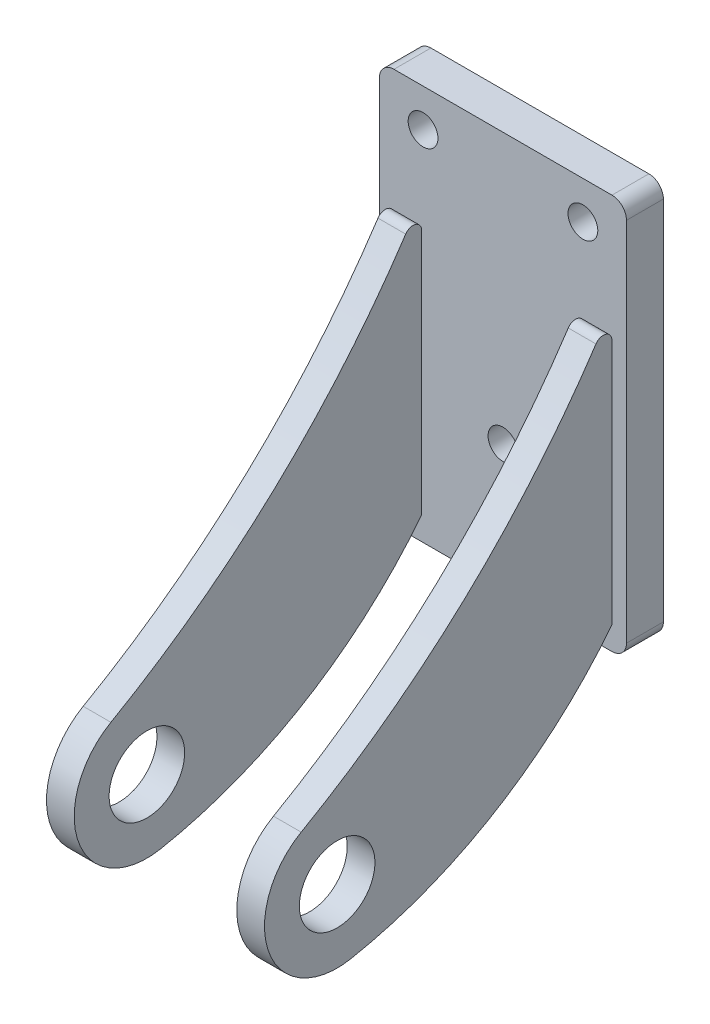
ISO-10303-21;
HEADER;
FILE_DESCRIPTION(('STEP AP214'),'2;1');
FILE_NAME('part.step','',(''),(''),'','','');
FILE_SCHEMA(('AUTOMOTIVE_DESIGN { 1 0 10303 214 1 1 1 1 }'));
ENDSEC;
DATA;
#1=APPLICATION_CONTEXT('core data for automotive mechanical design processes');
#2=APPLICATION_PROTOCOL_DEFINITION('international standard','automotive_design',2000,#1);
#3=PRODUCT_CONTEXT('',#1,'mechanical');
#4=PRODUCT('Part','Part','',(#3));
#5=PRODUCT_RELATED_PRODUCT_CATEGORY('part','',(#4));
#6=PRODUCT_DEFINITION_FORMATION('','',#4);
#7=PRODUCT_DEFINITION_CONTEXT('part definition',#1,'design');
#8=PRODUCT_DEFINITION('design','',#6,#7);
#9=PRODUCT_DEFINITION_SHAPE('','',#8);
#10=(LENGTH_UNIT() NAMED_UNIT(*) SI_UNIT(.MILLI.,.METRE.));
#11=(NAMED_UNIT(*) PLANE_ANGLE_UNIT() SI_UNIT($,.RADIAN.));
#12=(NAMED_UNIT(*) SI_UNIT($,.STERADIAN.) SOLID_ANGLE_UNIT());
#13=UNCERTAINTY_MEASURE_WITH_UNIT(LENGTH_MEASURE(1.E-05),#10,'distance_accuracy_value','');
#14=(GEOMETRIC_REPRESENTATION_CONTEXT(3) GLOBAL_UNCERTAINTY_ASSIGNED_CONTEXT((#13)) GLOBAL_UNIT_ASSIGNED_CONTEXT((#10,
#11,#12)) REPRESENTATION_CONTEXT('',''));
#15=CARTESIAN_POINT('',(0.,0.,0.));
#16=DIRECTION('',(0.,0.,1.));
#17=DIRECTION('',(1.,0.,0.));
#18=AXIS2_PLACEMENT_3D('',#15,#16,#17);
#19=CARTESIAN_POINT('',(37.5,-63.,6.35));
#20=DIRECTION('',(0.,0.,1.));
#21=DIRECTION('',(1.,0.,0.));
#22=AXIS2_PLACEMENT_3D('',#19,#20,#21);
#23=PLANE('',#22);
#24=CARTESIAN_POINT('',(0.,-25.,6.35));
#25=DIRECTION('',(0.,0.,1.));
#26=DIRECTION('',(1.,0.,0.));
#27=AXIS2_PLACEMENT_3D('',#24,#25,#26);
#28=CIRCLE('',#27,5.125);
#29=CARTESIAN_POINT('',(5.125,-25.,6.35));
#30=VERTEX_POINT('',#29);
#31=EDGE_CURVE('P0_E205',#30,#30,#28,.T.);
#32=ORIENTED_EDGE('',*,*,#31,.F.);
#33=EDGE_LOOP('',(#32));
#34=FACE_BOUND('',#33,.T.);
#35=CARTESIAN_POINT('',(-27.5,55.,6.35));
#36=DIRECTION('',(0.,0.,1.));
#37=DIRECTION('',(1.,0.,0.));
#38=AXIS2_PLACEMENT_3D('',#35,#36,#37);
#39=CIRCLE('',#38,5.125);
#40=CARTESIAN_POINT('',(-22.375,55.,6.35));
#41=VERTEX_POINT('',#40);
#42=EDGE_CURVE('P0_E188',#41,#41,#39,.T.);
#43=ORIENTED_EDGE('',*,*,#42,.F.);
#44=EDGE_LOOP('',(#43));
#45=FACE_BOUND('',#44,.T.);
#46=CARTESIAN_POINT('',(37.5,-63.,6.35));
#47=DIRECTION('',(0.,0.,1.));
#48=DIRECTION('',(1.,0.,0.));
#49=AXIS2_PLACEMENT_3D('',#46,#47,#48);
#50=CIRCLE('',#49,5.);
#51=CARTESIAN_POINT('',(37.5,-68.,6.35));
#52=VERTEX_POINT('',#51);
#53=CARTESIAN_POINT('',(42.5,-63.,6.35));
#54=VERTEX_POINT('',#53);
#55=EDGE_CURVE('P0_E151',#52,#54,#50,.T.);
#56=ORIENTED_EDGE('',*,*,#55,.T.);
#57=DIRECTION('',(0.,1.,0.));
#58=VECTOR('',#57,1.);
#59=CARTESIAN_POINT('',(42.5,63.,6.35));
#60=LINE('',#59,#58);
#61=CARTESIAN_POINT('',(42.5,63.,6.35));
#62=VERTEX_POINT('',#61);
#63=EDGE_CURVE('P0_E99',#54,#62,#60,.T.);
#64=ORIENTED_EDGE('',*,*,#63,.T.);
#65=CARTESIAN_POINT('',(37.5,63.,6.35));
#66=DIRECTION('',(0.,0.,1.));
#67=DIRECTION('',(-1.,0.,0.));
#68=AXIS2_PLACEMENT_3D('',#65,#66,#67);
#69=CIRCLE('',#68,5.);
#70=CARTESIAN_POINT('',(37.5,68.,6.35));
#71=VERTEX_POINT('',#70);
#72=EDGE_CURVE('P0_E166',#62,#71,#69,.T.);
#73=ORIENTED_EDGE('',*,*,#72,.T.);
#74=DIRECTION('',(-1.,0.,0.));
#75=VECTOR('',#74,1.);
#76=CARTESIAN_POINT('',(-37.5,68.,6.35));
#77=LINE('',#76,#75);
#78=CARTESIAN_POINT('',(-37.5,68.,6.35));
#79=VERTEX_POINT('',#78);
#80=EDGE_CURVE('P0_E179',#71,#79,#77,.T.);
#81=ORIENTED_EDGE('',*,*,#80,.T.);
#82=CARTESIAN_POINT('',(-37.5,63.,6.35));
#83=DIRECTION('',(0.,0.,1.));
#84=DIRECTION('',(1.,0.,0.));
#85=AXIS2_PLACEMENT_3D('',#82,#83,#84);
#86=CIRCLE('',#85,5.);
#87=CARTESIAN_POINT('',(-42.5,63.,6.35));
#88=VERTEX_POINT('',#87);
#89=EDGE_CURVE('P0_E118',#79,#88,#86,.T.);
#90=ORIENTED_EDGE('',*,*,#89,.T.);
#91=DIRECTION('',(0.,-1.,0.));
#92=VECTOR('',#91,1.);
#93=CARTESIAN_POINT('',(-42.5,63.,6.35));
#94=LINE('',#93,#92);
#95=CARTESIAN_POINT('',(-42.5,-63.,6.35));
#96=VERTEX_POINT('',#95);
#97=EDGE_CURVE('P0_E112',#88,#96,#94,.T.);
#98=ORIENTED_EDGE('',*,*,#97,.T.);
#99=CARTESIAN_POINT('',(-37.5,-63.,6.35));
#100=DIRECTION('',(0.,0.,1.));
#101=DIRECTION('',(1.,0.,0.));
#102=AXIS2_PLACEMENT_3D('',#99,#100,#101);
#103=CIRCLE('',#102,5.);
#104=CARTESIAN_POINT('',(-37.5,-68.,6.35));
#105=VERTEX_POINT('',#104);
#106=EDGE_CURVE('P0_E116',#96,#105,#103,.T.);
#107=ORIENTED_EDGE('',*,*,#106,.T.);
#108=DIRECTION('',(1.,0.,0.));
#109=VECTOR('',#108,1.);
#110=CARTESIAN_POINT('',(-37.5,-68.,6.35));
#111=LINE('',#110,#109);
#112=EDGE_CURVE('P0_E56',#105,#52,#111,.T.);
#113=ORIENTED_EDGE('',*,*,#112,.T.);
#114=EDGE_LOOP('',(#56,#64,#73,#81,#90,#98,#107,#113));
#115=FACE_BOUND('',#114,.T.);
#116=CARTESIAN_POINT('',(0.,-55.,6.35));
#117=DIRECTION('',(0.,0.,1.));
#118=DIRECTION('',(1.,0.,0.));
#119=AXIS2_PLACEMENT_3D('',#116,#117,#118);
#120=CIRCLE('',#119,5.125);
#121=CARTESIAN_POINT('',(5.12500000000001,-55.,6.35));
#122=VERTEX_POINT('',#121);
#123=EDGE_CURVE('P0_E140',#122,#122,#120,.T.);
#124=ORIENTED_EDGE('',*,*,#123,.F.);
#125=EDGE_LOOP('',(#124));
#126=FACE_BOUND('',#125,.T.);
#127=CARTESIAN_POINT('',(27.5,55.,6.35));
#128=DIRECTION('',(0.,0.,1.));
#129=DIRECTION('',(-1.,0.,0.));
#130=AXIS2_PLACEMENT_3D('',#127,#128,#129);
#131=CIRCLE('',#130,5.125);
#132=CARTESIAN_POINT('',(22.375,55.,6.35));
#133=VERTEX_POINT('',#132);
#134=EDGE_CURVE('P0_E194',#133,#133,#131,.T.);
#135=ORIENTED_EDGE('',*,*,#134,.F.);
#136=EDGE_LOOP('',(#135));
#137=FACE_BOUND('',#136,.T.);
#138=ADVANCED_FACE('P0_F39',(#34,#45,#115,#126,#137),#23,.T.);
#139=CARTESIAN_POINT('',(37.5,-63.,-6.35));
#140=DIRECTION('',(0.,0.,1.));
#141=DIRECTION('',(1.,0.,0.));
#142=AXIS2_PLACEMENT_3D('',#139,#140,#141);
#143=PLANE('',#142);
#144=CARTESIAN_POINT('',(0.,-25.,-6.35));
#145=DIRECTION('',(0.,0.,1.));
#146=DIRECTION('',(1.,0.,0.));
#147=AXIS2_PLACEMENT_3D('',#144,#145,#146);
#148=CIRCLE('',#147,5.125);
#149=CARTESIAN_POINT('',(5.125,-25.,-6.35));
#150=VERTEX_POINT('',#149);
#151=EDGE_CURVE('P0_E200',#150,#150,#148,.F.);
#152=ORIENTED_EDGE('',*,*,#151,.F.);
#153=EDGE_LOOP('',(#152));
#154=FACE_BOUND('',#153,.T.);
#155=CARTESIAN_POINT('',(37.5,-63.,-6.35));
#156=DIRECTION('',(0.,0.,1.));
#157=DIRECTION('',(1.,0.,0.));
#158=AXIS2_PLACEMENT_3D('',#155,#156,#157);
#159=CIRCLE('',#158,5.);
#160=CARTESIAN_POINT('',(37.5,-68.,-6.35));
#161=VERTEX_POINT('',#160);
#162=CARTESIAN_POINT('',(42.5,-63.,-6.35));
#163=VERTEX_POINT('',#162);
#164=EDGE_CURVE('P0_E136',#161,#163,#159,.T.);
#165=ORIENTED_EDGE('',*,*,#164,.F.);
#166=DIRECTION('',(1.,0.,0.));
#167=VECTOR('',#166,1.);
#168=CARTESIAN_POINT('',(-37.5,-68.,-6.35));
#169=LINE('',#168,#167);
#170=CARTESIAN_POINT('',(-37.5,-68.,-6.35));
#171=VERTEX_POINT('',#170);
#172=EDGE_CURVE('P0_E91',#171,#161,#169,.T.);
#173=ORIENTED_EDGE('',*,*,#172,.F.);
#174=CARTESIAN_POINT('',(-37.5,-63.,-6.35));
#175=DIRECTION('',(0.,0.,1.));
#176=DIRECTION('',(1.,0.,0.));
#177=AXIS2_PLACEMENT_3D('',#174,#175,#176);
#178=CIRCLE('',#177,5.);
#179=CARTESIAN_POINT('',(-42.5,-63.,-6.35));
#180=VERTEX_POINT('',#179);
#181=EDGE_CURVE('P0_E85',#180,#171,#178,.T.);
#182=ORIENTED_EDGE('',*,*,#181,.F.);
#183=DIRECTION('',(0.,-1.,0.));
#184=VECTOR('',#183,1.);
#185=CARTESIAN_POINT('',(-42.5,63.,-6.35));
#186=LINE('',#185,#184);
#187=CARTESIAN_POINT('',(-42.5,63.,-6.35));
#188=VERTEX_POINT('',#187);
#189=EDGE_CURVE('P0_E125',#188,#180,#186,.T.);
#190=ORIENTED_EDGE('',*,*,#189,.F.);
#191=CARTESIAN_POINT('',(-37.5,63.,-6.35));
#192=DIRECTION('',(0.,0.,1.));
#193=DIRECTION('',(1.,0.,0.));
#194=AXIS2_PLACEMENT_3D('',#191,#192,#193);
#195=CIRCLE('',#194,5.);
#196=CARTESIAN_POINT('',(-37.5,68.,-6.35));
#197=VERTEX_POINT('',#196);
#198=EDGE_CURVE('P0_E146',#197,#188,#195,.T.);
#199=ORIENTED_EDGE('',*,*,#198,.F.);
#200=DIRECTION('',(-1.,0.,0.));
#201=VECTOR('',#200,1.);
#202=CARTESIAN_POINT('',(-37.5,68.,-6.35));
#203=LINE('',#202,#201);
#204=CARTESIAN_POINT('',(37.5,68.,-6.35));
#205=VERTEX_POINT('',#204);
#206=EDGE_CURVE('P0_E144',#205,#197,#203,.T.);
#207=ORIENTED_EDGE('',*,*,#206,.F.);
#208=CARTESIAN_POINT('',(37.5,63.,-6.35));
#209=DIRECTION('',(0.,0.,1.));
#210=DIRECTION('',(-1.,0.,0.));
#211=AXIS2_PLACEMENT_3D('',#208,#209,#210);
#212=CIRCLE('',#211,5.);
#213=CARTESIAN_POINT('',(42.5,63.,-6.35));
#214=VERTEX_POINT('',#213);
#215=EDGE_CURVE('P0_E142',#214,#205,#212,.T.);
#216=ORIENTED_EDGE('',*,*,#215,.F.);
#217=DIRECTION('',(0.,1.,0.));
#218=VECTOR('',#217,1.);
#219=CARTESIAN_POINT('',(42.5,63.,-6.35));
#220=LINE('',#219,#218);
#221=EDGE_CURVE('P0_E139',#163,#214,#220,.T.);
#222=ORIENTED_EDGE('',*,*,#221,.F.);
#223=EDGE_LOOP('',(#165,#173,#182,#190,#199,#207,#216,#222));
#224=FACE_BOUND('',#223,.T.);
#225=CARTESIAN_POINT('',(0.,-55.,-6.35));
#226=DIRECTION('',(0.,0.,1.));
#227=DIRECTION('',(1.,0.,0.));
#228=AXIS2_PLACEMENT_3D('',#225,#226,#227);
#229=CIRCLE('',#228,5.125);
#230=CARTESIAN_POINT('',(5.12500000000001,-55.,-6.35));
#231=VERTEX_POINT('',#230);
#232=EDGE_CURVE('P0_E185',#231,#231,#229,.T.);
#233=ORIENTED_EDGE('',*,*,#232,.T.);
#234=EDGE_LOOP('',(#233));
#235=FACE_BOUND('',#234,.T.);
#236=CARTESIAN_POINT('',(-27.5,55.,-6.35));
#237=DIRECTION('',(0.,0.,1.));
#238=DIRECTION('',(1.,0.,0.));
#239=AXIS2_PLACEMENT_3D('',#236,#237,#238);
#240=CIRCLE('',#239,5.125);
#241=CARTESIAN_POINT('',(-22.375,55.,-6.35));
#242=VERTEX_POINT('',#241);
#243=EDGE_CURVE('P0_E191',#242,#242,#240,.T.);
#244=ORIENTED_EDGE('',*,*,#243,.T.);
#245=EDGE_LOOP('',(#244));
#246=FACE_BOUND('',#245,.T.);
#247=CARTESIAN_POINT('',(27.5,55.,-6.35));
#248=DIRECTION('',(0.,0.,1.));
#249=DIRECTION('',(-1.,0.,0.));
#250=AXIS2_PLACEMENT_3D('',#247,#248,#249);
#251=CIRCLE('',#250,5.125);
#252=CARTESIAN_POINT('',(22.375,55.,-6.35));
#253=VERTEX_POINT('',#252);
#254=EDGE_CURVE('P0_E197',#253,#253,#251,.T.);
#255=ORIENTED_EDGE('',*,*,#254,.T.);
#256=EDGE_LOOP('',(#255));
#257=FACE_BOUND('',#256,.T.);
#258=ADVANCED_FACE('P0_F170',(#154,#224,#235,#246,#257),#143,.F.);
#259=CARTESIAN_POINT('',(37.5,-63.,6.35));
#260=DIRECTION('',(0.,0.,-1.));
#261=DIRECTION('',(-1.,0.,0.));
#262=AXIS2_PLACEMENT_3D('',#259,#260,#261);
#263=CYLINDRICAL_SURFACE('',#262,5.);
#264=ORIENTED_EDGE('',*,*,#164,.T.);
#265=DIRECTION('',(0.,0.,-1.));
#266=VECTOR('',#265,1.);
#267=CARTESIAN_POINT('',(42.5,-63.,6.35));
#268=LINE('',#267,#266);
#269=EDGE_CURVE('P0_E12',#54,#163,#268,.T.);
#270=ORIENTED_EDGE('',*,*,#269,.F.);
#271=ORIENTED_EDGE('',*,*,#55,.F.);
#272=DIRECTION('',(0.,0.,-1.));
#273=VECTOR('',#272,1.);
#274=CARTESIAN_POINT('',(37.5,-68.,6.35));
#275=LINE('',#274,#273);
#276=EDGE_CURVE('P0_E131',#52,#161,#275,.T.);
#277=ORIENTED_EDGE('',*,*,#276,.T.);
#278=EDGE_LOOP('',(#264,#270,#271,#277));
#279=FACE_BOUND('',#278,.T.);
#280=ADVANCED_FACE('P0_F41',(#279),#263,.T.);
#281=CARTESIAN_POINT('',(42.5,63.,6.35));
#282=DIRECTION('',(-1.,0.,0.));
#283=DIRECTION('',(0.,-1.,0.));
#284=AXIS2_PLACEMENT_3D('',#281,#282,#283);
#285=PLANE('',#284);
#286=ORIENTED_EDGE('',*,*,#221,.T.);
#287=DIRECTION('',(0.,0.,-1.));
#288=VECTOR('',#287,1.);
#289=CARTESIAN_POINT('',(42.5,63.,6.35));
#290=LINE('',#289,#288);
#291=EDGE_CURVE('P0_E48',#62,#214,#290,.T.);
#292=ORIENTED_EDGE('',*,*,#291,.F.);
#293=ORIENTED_EDGE('',*,*,#63,.F.);
#294=ORIENTED_EDGE('',*,*,#269,.T.);
#295=EDGE_LOOP('',(#286,#292,#293,#294));
#296=FACE_BOUND('',#295,.T.);
#297=ADVANCED_FACE('P0_F254',(#296),#285,.F.);
#298=CARTESIAN_POINT('',(37.5,63.,6.35));
#299=DIRECTION('',(0.,0.,-1.));
#300=DIRECTION('',(-1.,0.,0.));
#301=AXIS2_PLACEMENT_3D('',#298,#299,#300);
#302=CYLINDRICAL_SURFACE('',#301,5.);
#303=ORIENTED_EDGE('',*,*,#215,.T.);
#304=DIRECTION('',(0.,0.,-1.));
#305=VECTOR('',#304,1.);
#306=CARTESIAN_POINT('',(37.5,68.,6.35));
#307=LINE('',#306,#305);
#308=EDGE_CURVE('P0_E158',#71,#205,#307,.T.);
#309=ORIENTED_EDGE('',*,*,#308,.F.);
#310=ORIENTED_EDGE('',*,*,#72,.F.);
#311=ORIENTED_EDGE('',*,*,#291,.T.);
#312=EDGE_LOOP('',(#303,#309,#310,#311));
#313=FACE_BOUND('',#312,.T.);
#314=ADVANCED_FACE('P0_F164',(#313),#302,.T.);
#315=CARTESIAN_POINT('',(-37.5,68.,6.35));
#316=DIRECTION('',(0.,-1.,0.));
#317=DIRECTION('',(0.,0.,-1.));
#318=AXIS2_PLACEMENT_3D('',#315,#316,#317);
#319=PLANE('',#318);
#320=ORIENTED_EDGE('',*,*,#206,.T.);
#321=DIRECTION('',(0.,0.,-1.));
#322=VECTOR('',#321,1.);
#323=CARTESIAN_POINT('',(-37.5,68.,6.35));
#324=LINE('',#323,#322);
#325=EDGE_CURVE('P0_E155',#79,#197,#324,.T.);
#326=ORIENTED_EDGE('',*,*,#325,.F.);
#327=ORIENTED_EDGE('',*,*,#80,.F.);
#328=ORIENTED_EDGE('',*,*,#308,.T.);
#329=EDGE_LOOP('',(#320,#326,#327,#328));
#330=FACE_BOUND('',#329,.T.);
#331=ADVANCED_FACE('P0_F175',(#330),#319,.F.);
#332=CARTESIAN_POINT('',(-37.5,63.,6.35));
#333=DIRECTION('',(0.,0.,-1.));
#334=DIRECTION('',(-1.,0.,0.));
#335=AXIS2_PLACEMENT_3D('',#332,#333,#334);
#336=CYLINDRICAL_SURFACE('',#335,5.);
#337=ORIENTED_EDGE('',*,*,#198,.T.);
#338=DIRECTION('',(0.,0.,-1.));
#339=VECTOR('',#338,1.);
#340=CARTESIAN_POINT('',(-42.5,63.,6.35));
#341=LINE('',#340,#339);
#342=EDGE_CURVE('P0_E126',#88,#188,#341,.T.);
#343=ORIENTED_EDGE('',*,*,#342,.F.);
#344=ORIENTED_EDGE('',*,*,#89,.F.);
#345=ORIENTED_EDGE('',*,*,#325,.T.);
#346=EDGE_LOOP('',(#337,#343,#344,#345));
#347=FACE_BOUND('',#346,.T.);
#348=ADVANCED_FACE('P0_F178',(#347),#336,.T.);
#349=CARTESIAN_POINT('',(-42.5,63.,6.35));
#350=DIRECTION('',(1.,0.,0.));
#351=DIRECTION('',(0.,1.,0.));
#352=AXIS2_PLACEMENT_3D('',#349,#350,#351);
#353=PLANE('',#352);
#354=ORIENTED_EDGE('',*,*,#189,.T.);
#355=DIRECTION('',(0.,0.,-1.));
#356=VECTOR('',#355,1.);
#357=CARTESIAN_POINT('',(-42.5,-63.,6.35));
#358=LINE('',#357,#356);
#359=EDGE_CURVE('P0_E122',#96,#180,#358,.T.);
#360=ORIENTED_EDGE('',*,*,#359,.F.);
#361=ORIENTED_EDGE('',*,*,#97,.F.);
#362=ORIENTED_EDGE('',*,*,#342,.T.);
#363=EDGE_LOOP('',(#354,#360,#361,#362));
#364=FACE_BOUND('',#363,.T.);
#365=ADVANCED_FACE('P0_F123',(#364),#353,.F.);
#366=CARTESIAN_POINT('',(-37.5,-63.,6.35));
#367=DIRECTION('',(0.,0.,-1.));
#368=DIRECTION('',(-1.,0.,0.));
#369=AXIS2_PLACEMENT_3D('',#366,#367,#368);
#370=CYLINDRICAL_SURFACE('',#369,5.);
#371=ORIENTED_EDGE('',*,*,#181,.T.);
#372=DIRECTION('',(0.,0.,-1.));
#373=VECTOR('',#372,1.);
#374=CARTESIAN_POINT('',(-37.5,-68.,6.35));
#375=LINE('',#374,#373);
#376=EDGE_CURVE('P0_E127',#105,#171,#375,.T.);
#377=ORIENTED_EDGE('',*,*,#376,.F.);
#378=ORIENTED_EDGE('',*,*,#106,.F.);
#379=ORIENTED_EDGE('',*,*,#359,.T.);
#380=EDGE_LOOP('',(#371,#377,#378,#379));
#381=FACE_BOUND('',#380,.T.);
#382=ADVANCED_FACE('P0_F129',(#381),#370,.T.);
#383=CARTESIAN_POINT('',(-37.5,-68.,6.35));
#384=DIRECTION('',(0.,1.,0.));
#385=DIRECTION('',(0.,0.,1.));
#386=AXIS2_PLACEMENT_3D('',#383,#384,#385);
#387=PLANE('',#386);
#388=ORIENTED_EDGE('',*,*,#172,.T.);
#389=ORIENTED_EDGE('',*,*,#276,.F.);
#390=ORIENTED_EDGE('',*,*,#112,.F.);
#391=ORIENTED_EDGE('',*,*,#376,.T.);
#392=EDGE_LOOP('',(#388,#389,#390,#391));
#393=FACE_BOUND('',#392,.T.);
#394=ADVANCED_FACE('P0_F240',(#393),#387,.F.);
#395=CARTESIAN_POINT('',(0.,-55.,6.35));
#396=DIRECTION('',(0.,0.,-1.));
#397=DIRECTION('',(-1.,0.,0.));
#398=AXIS2_PLACEMENT_3D('',#395,#396,#397);
#399=CYLINDRICAL_SURFACE('',#398,5.125);
#400=ORIENTED_EDGE('',*,*,#123,.T.);
#401=EDGE_LOOP('',(#400));
#402=FACE_BOUND('',#401,.T.);
#403=ORIENTED_EDGE('',*,*,#232,.F.);
#404=EDGE_LOOP('',(#403));
#405=FACE_BOUND('',#404,.T.);
#406=ADVANCED_FACE('P0_F221',(#402,#405),#399,.F.);
#407=CARTESIAN_POINT('',(-27.5,55.,6.35));
#408=DIRECTION('',(0.,0.,-1.));
#409=DIRECTION('',(-1.,0.,0.));
#410=AXIS2_PLACEMENT_3D('',#407,#408,#409);
#411=CYLINDRICAL_SURFACE('',#410,5.125);
#412=ORIENTED_EDGE('',*,*,#42,.T.);
#413=EDGE_LOOP('',(#412));
#414=FACE_BOUND('',#413,.T.);
#415=ORIENTED_EDGE('',*,*,#243,.F.);
#416=EDGE_LOOP('',(#415));
#417=FACE_BOUND('',#416,.T.);
#418=ADVANCED_FACE('P0_F217',(#414,#417),#411,.F.);
#419=CARTESIAN_POINT('',(27.5,55.,6.35));
#420=DIRECTION('',(0.,0.,-1.));
#421=DIRECTION('',(-1.,0.,0.));
#422=AXIS2_PLACEMENT_3D('',#419,#420,#421);
#423=CYLINDRICAL_SURFACE('',#422,5.125);
#424=ORIENTED_EDGE('',*,*,#134,.T.);
#425=EDGE_LOOP('',(#424));
#426=FACE_BOUND('',#425,.T.);
#427=ORIENTED_EDGE('',*,*,#254,.F.);
#428=EDGE_LOOP('',(#427));
#429=FACE_BOUND('',#428,.T.);
#430=ADVANCED_FACE('P0_F220',(#426,#429),#423,.F.);
#431=CARTESIAN_POINT('',(0.,-25.,-6.351));
#432=DIRECTION('',(0.,0.,1.));
#433=DIRECTION('',(1.,0.,0.));
#434=AXIS2_PLACEMENT_3D('',#431,#432,#433);
#435=CYLINDRICAL_SURFACE('',#434,5.125);
#436=ORIENTED_EDGE('',*,*,#31,.T.);
#437=EDGE_LOOP('',(#436));
#438=FACE_BOUND('',#437,.T.);
#439=ORIENTED_EDGE('',*,*,#151,.T.);
#440=EDGE_LOOP('',(#439));
#441=FACE_BOUND('',#440,.T.);
#442=ADVANCED_FACE('P0_F209',(#438,#441),#435,.F.);
#443=CLOSED_SHELL('',(#138,#258,#280,#297,#314,#331,#348,#365,#382,#394,#406,#418,#430,#442));
#444=MANIFOLD_SOLID_BREP('P0_B2',#443);
#445=CARTESIAN_POINT('',(27.9700000000027,192.307751543955,261.799156006014));
#446=DIRECTION('',(-1.,0.,0.));
#447=DIRECTION('',(0.,0.,1.));
#448=AXIS2_PLACEMENT_3D('',#445,#446,#447);
#449=PLANE('',#448);
#450=CARTESIAN_POINT('',(27.9700000000027,192.307751543955,261.799156006014));
#451=DIRECTION('',(1.,0.,0.));
#452=DIRECTION('',(0.,0.,1.));
#453=AXIS2_PLACEMENT_3D('',#450,#451,#452);
#454=CIRCLE('',#453,300.);
#455=CARTESIAN_POINT('',(27.9700000000012,-68.3488080385464,113.279265262001));
#456=VERTEX_POINT('',#455);
#457=CARTESIAN_POINT('',(27.9700000000001,26.4006457290526,11.8494965941187));
#458=VERTEX_POINT('',#457);
#459=EDGE_CURVE('P1_E72',#456,#458,#454,.T.);
#460=ORIENTED_EDGE('',*,*,#459,.T.);
#461=CARTESIAN_POINT('',(27.9700000000001,24.7415746709035,9.34999999999974));
#462=DIRECTION('',(-1.,0.,0.));
#463=DIRECTION('',(0.,0.,1.));
#464=AXIS2_PLACEMENT_3D('',#461,#462,#463);
#465=CIRCLE('',#464,3.);
#466=CARTESIAN_POINT('',(27.9700000000001,24.7415746709035,6.34999999999971));
#467=VERTEX_POINT('',#466);
#468=EDGE_CURVE('P1_E11',#458,#467,#465,.T.);
#469=ORIENTED_EDGE('',*,*,#468,.T.);
#470=DIRECTION('',(0.,-1.,0.));
#471=VECTOR('',#470,1.);
#472=CARTESIAN_POINT('',(27.9700000000001,35.,6.34999999999971));
#473=LINE('',#472,#471);
#474=CARTESIAN_POINT('',(27.9700000000001,-60.,6.34999999999972));
#475=VERTEX_POINT('',#474);
#476=EDGE_CURVE('P1_E62',#467,#475,#473,.T.);
#477=ORIENTED_EDGE('',*,*,#476,.T.);
#478=CARTESIAN_POINT('',(27.9700000000013,32.7293638393421,124.253626245976));
#479=DIRECTION('',(-1.,0.,0.));
#480=DIRECTION('',(0.,0.,1.));
#481=AXIS2_PLACEMENT_3D('',#478,#479,#480);
#482=CIRCLE('',#481,150.);
#483=CARTESIAN_POINT('',(27.970000000001,-114.630098372374,96.2324039908043));
#484=VERTEX_POINT('',#483);
#485=EDGE_CURVE('P1_E66',#475,#484,#482,.T.);
#486=ORIENTED_EDGE('',*,*,#485,.T.);
#487=CARTESIAN_POINT('',(27.9700000000011,-90.0701880037549,100.9026077));
#488=DIRECTION('',(-1.,0.,0.));
#489=DIRECTION('',(0.,0.,1.));
#490=AXIS2_PLACEMENT_3D('',#487,#488,#489);
#491=CIRCLE('',#490,25.);
#492=EDGE_CURVE('P1_E86',#484,#456,#491,.T.);
#493=ORIENTED_EDGE('',*,*,#492,.T.);
#494=EDGE_LOOP('',(#460,#469,#477,#486,#493));
#495=FACE_BOUND('',#494,.T.);
#496=CARTESIAN_POINT('',(27.9700000000011,-90.0701880037549,100.9026077));
#497=DIRECTION('',(-1.,0.,0.));
#498=DIRECTION('',(0.,0.,1.));
#499=AXIS2_PLACEMENT_3D('',#496,#497,#498);
#500=CIRCLE('',#499,13.);
#501=CARTESIAN_POINT('',(27.9700000000012,-90.0701880037549,113.9026077));
#502=VERTEX_POINT('',#501);
#503=EDGE_CURVE('P1_E94',#502,#502,#500,.T.);
#504=ORIENTED_EDGE('',*,*,#503,.F.);
#505=EDGE_LOOP('',(#504));
#506=FACE_BOUND('',#505,.T.);
#507=ADVANCED_FACE('P1_F16',(#495,#506),#449,.T.);
#508=CARTESIAN_POINT('',(37.5000000000028,192.307751543955,261.799156006014));
#509=DIRECTION('',(-1.,0.,0.));
#510=DIRECTION('',(0.,0.,1.));
#511=AXIS2_PLACEMENT_3D('',#508,#509,#510);
#512=PLANE('',#511);
#513=DIRECTION('',(0.,-1.,0.));
#514=VECTOR('',#513,1.);
#515=CARTESIAN_POINT('',(37.5000000000001,35.,6.34999999999961));
#516=LINE('',#515,#514);
#517=CARTESIAN_POINT('',(37.5000000000001,24.7415746709035,6.34999999999961));
#518=VERTEX_POINT('',#517);
#519=CARTESIAN_POINT('',(37.5000000000001,-60.,6.34999999999962));
#520=VERTEX_POINT('',#519);
#521=EDGE_CURVE('P1_E77',#518,#520,#516,.T.);
#522=ORIENTED_EDGE('',*,*,#521,.F.);
#523=CARTESIAN_POINT('',(37.5000000000001,24.7415746709035,9.34999999999964));
#524=DIRECTION('',(-1.,0.,0.));
#525=DIRECTION('',(0.,0.,1.));
#526=AXIS2_PLACEMENT_3D('',#523,#524,#525);
#527=CIRCLE('',#526,3.);
#528=CARTESIAN_POINT('',(37.5000000000001,26.4006457290526,11.8494965941186));
#529=VERTEX_POINT('',#528);
#530=EDGE_CURVE('P1_E38',#518,#529,#527,.F.);
#531=ORIENTED_EDGE('',*,*,#530,.T.);
#532=CARTESIAN_POINT('',(37.5000000000028,192.307751543955,261.799156006014));
#533=DIRECTION('',(1.,0.,0.));
#534=DIRECTION('',(0.,0.,1.));
#535=AXIS2_PLACEMENT_3D('',#532,#533,#534);
#536=CIRCLE('',#535,300.);
#537=CARTESIAN_POINT('',(37.5000000000012,-68.3488080385464,113.279265262001));
#538=VERTEX_POINT('',#537);
#539=EDGE_CURVE('P1_E92',#538,#529,#536,.T.);
#540=ORIENTED_EDGE('',*,*,#539,.F.);
#541=CARTESIAN_POINT('',(37.5000000000011,-90.0701880037549,100.9026077));
#542=DIRECTION('',(-1.,0.,0.));
#543=DIRECTION('',(0.,0.,1.));
#544=AXIS2_PLACEMENT_3D('',#541,#542,#543);
#545=CIRCLE('',#544,25.);
#546=CARTESIAN_POINT('',(37.500000000001,-114.630098372374,96.2324039908042));
#547=VERTEX_POINT('',#546);
#548=EDGE_CURVE('P1_E98',#547,#538,#545,.T.);
#549=ORIENTED_EDGE('',*,*,#548,.F.);
#550=CARTESIAN_POINT('',(37.5000000000013,32.7293638393421,124.253626245976));
#551=DIRECTION('',(-1.,0.,0.));
#552=DIRECTION('',(0.,0.,1.));
#553=AXIS2_PLACEMENT_3D('',#550,#551,#552);
#554=CIRCLE('',#553,150.);
#555=EDGE_CURVE('P1_E96',#520,#547,#554,.T.);
#556=ORIENTED_EDGE('',*,*,#555,.F.);
#557=EDGE_LOOP('',(#522,#531,#540,#549,#556));
#558=FACE_BOUND('',#557,.T.);
#559=CARTESIAN_POINT('',(37.5000000000011,-90.0701880037549,100.9026077));
#560=DIRECTION('',(-1.,0.,0.));
#561=DIRECTION('',(0.,0.,1.));
#562=AXIS2_PLACEMENT_3D('',#559,#560,#561);
#563=CIRCLE('',#562,13.);
#564=CARTESIAN_POINT('',(37.5000000000012,-90.0701880037549,113.9026077));
#565=VERTEX_POINT('',#564);
#566=EDGE_CURVE('P1_E189',#565,#565,#563,.T.);
#567=ORIENTED_EDGE('',*,*,#566,.T.);
#568=EDGE_LOOP('',(#567));
#569=FACE_BOUND('',#568,.T.);
#570=ADVANCED_FACE('P1_F105',(#558,#569),#512,.F.);
#571=CARTESIAN_POINT('',(27.9700000000027,192.307751543955,261.799156006014));
#572=DIRECTION('',(1.,0.,0.));
#573=DIRECTION('',(0.,0.,-1.));
#574=AXIS2_PLACEMENT_3D('',#571,#572,#573);
#575=CYLINDRICAL_SURFACE('',#574,300.);
#576=ORIENTED_EDGE('',*,*,#539,.T.);
#577=DIRECTION('',(1.,0.,0.));
#578=VECTOR('',#577,1.);
#579=CARTESIAN_POINT('',(27.9700000000001,26.4006457290525,11.8494965941187));
#580=LINE('',#579,#578);
#581=EDGE_CURVE('P1_E24',#529,#458,#580,.F.);
#582=ORIENTED_EDGE('',*,*,#581,.T.);
#583=ORIENTED_EDGE('',*,*,#459,.F.);
#584=DIRECTION('',(1.,0.,0.));
#585=VECTOR('',#584,1.);
#586=CARTESIAN_POINT('',(27.9700000000012,-68.3488080385464,113.279265262001));
#587=LINE('',#586,#585);
#588=EDGE_CURVE('P1_E88',#456,#538,#587,.T.);
#589=ORIENTED_EDGE('',*,*,#588,.T.);
#590=EDGE_LOOP('',(#576,#582,#583,#589));
#591=FACE_BOUND('',#590,.T.);
#592=ADVANCED_FACE('P1_F124',(#591),#575,.F.);
#593=CARTESIAN_POINT('',(27.9700000000001,35.,6.34999999999971));
#594=DIRECTION('',(0.,0.,1.));
#595=DIRECTION('',(0.,1.,0.));
#596=AXIS2_PLACEMENT_3D('',#593,#594,#595);
#597=PLANE('',#596);
#598=ORIENTED_EDGE('',*,*,#476,.F.);
#599=DIRECTION('',(1.,0.,0.));
#600=VECTOR('',#599,1.);
#601=CARTESIAN_POINT('',(27.9700000000001,24.7415746709035,6.34999999999971));
#602=LINE('',#601,#600);
#603=EDGE_CURVE('P1_E80',#467,#518,#602,.T.);
#604=ORIENTED_EDGE('',*,*,#603,.T.);
#605=ORIENTED_EDGE('',*,*,#521,.T.);
#606=DIRECTION('',(1.,0.,0.));
#607=VECTOR('',#606,1.);
#608=CARTESIAN_POINT('',(27.9700000000001,-60.,6.34999999999972));
#609=LINE('',#608,#607);
#610=EDGE_CURVE('P1_E75',#475,#520,#609,.T.);
#611=ORIENTED_EDGE('',*,*,#610,.F.);
#612=EDGE_LOOP('',(#598,#604,#605,#611));
#613=FACE_BOUND('',#612,.T.);
#614=ADVANCED_FACE('P1_F76',(#613),#597,.F.);
#615=CARTESIAN_POINT('',(27.9700000000013,32.7293638393421,124.253626245976));
#616=DIRECTION('',(1.,0.,0.));
#617=DIRECTION('',(0.,0.,-1.));
#618=AXIS2_PLACEMENT_3D('',#615,#616,#617);
#619=CYLINDRICAL_SURFACE('',#618,150.);
#620=ORIENTED_EDGE('',*,*,#555,.T.);
#621=DIRECTION('',(1.,0.,0.));
#622=VECTOR('',#621,1.);
#623=CARTESIAN_POINT('',(27.970000000001,-114.630098372374,96.2324039908043));
#624=LINE('',#623,#622);
#625=EDGE_CURVE('P1_E81',#484,#547,#624,.T.);
#626=ORIENTED_EDGE('',*,*,#625,.F.);
#627=ORIENTED_EDGE('',*,*,#485,.F.);
#628=ORIENTED_EDGE('',*,*,#610,.T.);
#629=EDGE_LOOP('',(#620,#626,#627,#628));
#630=FACE_BOUND('',#629,.T.);
#631=ADVANCED_FACE('P1_F83',(#630),#619,.T.);
#632=CARTESIAN_POINT('',(27.9700000000011,-90.0701880037549,100.9026077));
#633=DIRECTION('',(1.,0.,0.));
#634=DIRECTION('',(0.,0.,-1.));
#635=AXIS2_PLACEMENT_3D('',#632,#633,#634);
#636=CYLINDRICAL_SURFACE('',#635,25.);
#637=ORIENTED_EDGE('',*,*,#548,.T.);
#638=ORIENTED_EDGE('',*,*,#588,.F.);
#639=ORIENTED_EDGE('',*,*,#492,.F.);
#640=ORIENTED_EDGE('',*,*,#625,.T.);
#641=EDGE_LOOP('',(#637,#638,#639,#640));
#642=FACE_BOUND('',#641,.T.);
#643=ADVANCED_FACE('P1_F109',(#642),#636,.T.);
#644=CARTESIAN_POINT('',(27.9700000000011,-90.0701880037549,100.9026077));
#645=DIRECTION('',(1.,0.,0.));
#646=DIRECTION('',(0.,0.,-1.));
#647=AXIS2_PLACEMENT_3D('',#644,#645,#646);
#648=CYLINDRICAL_SURFACE('',#647,13.);
#649=ORIENTED_EDGE('',*,*,#503,.T.);
#650=EDGE_LOOP('',(#649));
#651=FACE_BOUND('',#650,.T.);
#652=ORIENTED_EDGE('',*,*,#566,.F.);
#653=EDGE_LOOP('',(#652));
#654=FACE_BOUND('',#653,.T.);
#655=ADVANCED_FACE('P1_F112',(#651,#654),#648,.F.);
#656=CARTESIAN_POINT('',(27.9700000000001,24.7415746709035,9.34999999999974));
#657=DIRECTION('',(1.,0.,0.));
#658=DIRECTION('',(0.,0.,-1.));
#659=AXIS2_PLACEMENT_3D('',#656,#657,#658);
#660=CYLINDRICAL_SURFACE('',#659,3.);
#661=ORIENTED_EDGE('',*,*,#468,.F.);
#662=ORIENTED_EDGE('',*,*,#581,.F.);
#663=ORIENTED_EDGE('',*,*,#530,.F.);
#664=ORIENTED_EDGE('',*,*,#603,.F.);
#665=EDGE_LOOP('',(#661,#662,#663,#664));
#666=FACE_BOUND('',#665,.T.);
#667=ADVANCED_FACE('P1_F18',(#666),#660,.T.);
#668=CLOSED_SHELL('',(#507,#570,#592,#614,#631,#643,#655,#667));
#669=MANIFOLD_SOLID_BREP('P1_B1',#668);
#670=CARTESIAN_POINT('',(-37.4999999999972,192.307751543955,261.799156006015));
#671=DIRECTION('',(-1.,0.,0.));
#672=DIRECTION('',(0.,0.,1.));
#673=AXIS2_PLACEMENT_3D('',#670,#671,#672);
#674=PLANE('',#673);
#675=CARTESIAN_POINT('',(-37.4999999999972,192.307751543955,261.799156006015));
#676=DIRECTION('',(1.,0.,0.));
#677=DIRECTION('',(0.,0.,1.));
#678=AXIS2_PLACEMENT_3D('',#675,#676,#677);
#679=CIRCLE('',#678,300.);
#680=CARTESIAN_POINT('',(-37.4999999999988,-68.3488080385464,113.279265262001));
#681=VERTEX_POINT('',#680);
#682=CARTESIAN_POINT('',(-37.4999999999999,26.4006457290526,11.8494965941194));
#683=VERTEX_POINT('',#682);
#684=EDGE_CURVE('P2_E80',#681,#683,#679,.T.);
#685=ORIENTED_EDGE('',*,*,#684,.T.);
#686=CARTESIAN_POINT('',(-37.4999999999999,24.7415746709035,9.35000000000041));
#687=DIRECTION('',(-1.,0.,0.));
#688=DIRECTION('',(0.,0.,1.));
#689=AXIS2_PLACEMENT_3D('',#686,#687,#688);
#690=CIRCLE('',#689,3.);
#691=CARTESIAN_POINT('',(-37.4999999999999,24.7415746709035,6.35000000000038));
#692=VERTEX_POINT('',#691);
#693=EDGE_CURVE('P2_E13',#683,#692,#690,.T.);
#694=ORIENTED_EDGE('',*,*,#693,.T.);
#695=DIRECTION('',(0.,-1.,0.));
#696=VECTOR('',#695,1.);
#697=CARTESIAN_POINT('',(-37.4999999999999,35.,6.35000000000038));
#698=LINE('',#697,#696);
#699=CARTESIAN_POINT('',(-37.4999999999999,-60.,6.35000000000039));
#700=VERTEX_POINT('',#699);
#701=EDGE_CURVE('P2_E70',#692,#700,#698,.T.);
#702=ORIENTED_EDGE('',*,*,#701,.T.);
#703=CARTESIAN_POINT('',(-37.4999999999987,32.7293638393421,124.253626245977));
#704=DIRECTION('',(-1.,0.,0.));
#705=DIRECTION('',(0.,0.,1.));
#706=AXIS2_PLACEMENT_3D('',#703,#704,#705);
#707=CIRCLE('',#706,150.);
#708=CARTESIAN_POINT('',(-37.499999999999,-114.630098372374,96.232403990805));
#709=VERTEX_POINT('',#708);
#710=EDGE_CURVE('P2_E74',#700,#709,#707,.T.);
#711=ORIENTED_EDGE('',*,*,#710,.T.);
#712=CARTESIAN_POINT('',(-37.4999999999989,-90.0701880037549,100.9026077));
#713=DIRECTION('',(-1.,0.,0.));
#714=DIRECTION('',(0.,0.,1.));
#715=AXIS2_PLACEMENT_3D('',#712,#713,#714);
#716=CIRCLE('',#715,25.);
#717=EDGE_CURVE('P2_E94',#709,#681,#716,.T.);
#718=ORIENTED_EDGE('',*,*,#717,.T.);
#719=EDGE_LOOP('',(#685,#694,#702,#711,#718));
#720=FACE_BOUND('',#719,.T.);
#721=CARTESIAN_POINT('',(-37.4999999999989,-90.0701880037549,100.9026077));
#722=DIRECTION('',(-1.,0.,0.));
#723=DIRECTION('',(0.,0.,1.));
#724=AXIS2_PLACEMENT_3D('',#721,#722,#723);
#725=CIRCLE('',#724,13.);
#726=CARTESIAN_POINT('',(-37.4999999999988,-90.0701880037549,113.9026077));
#727=VERTEX_POINT('',#726);
#728=EDGE_CURVE('P2_E102',#727,#727,#725,.T.);
#729=ORIENTED_EDGE('',*,*,#728,.F.);
#730=EDGE_LOOP('',(#729));
#731=FACE_BOUND('',#730,.T.);
#732=ADVANCED_FACE('P2_F24',(#720,#731),#674,.T.);
#733=CARTESIAN_POINT('',(-27.9699999999972,192.307751543955,261.799156006015));
#734=DIRECTION('',(-1.,0.,0.));
#735=DIRECTION('',(0.,0.,1.));
#736=AXIS2_PLACEMENT_3D('',#733,#734,#735);
#737=PLANE('',#736);
#738=DIRECTION('',(0.,-1.,0.));
#739=VECTOR('',#738,1.);
#740=CARTESIAN_POINT('',(-27.9699999999999,35.,6.35000000000029));
#741=LINE('',#740,#739);
#742=CARTESIAN_POINT('',(-27.9699999999999,24.7415746709035,6.35000000000029));
#743=VERTEX_POINT('',#742);
#744=CARTESIAN_POINT('',(-27.9699999999999,-60.,6.35000000000029));
#745=VERTEX_POINT('',#744);
#746=EDGE_CURVE('P2_E85',#743,#745,#741,.T.);
#747=ORIENTED_EDGE('',*,*,#746,.F.);
#748=CARTESIAN_POINT('',(-27.9699999999999,24.7415746709035,9.35000000000032));
#749=DIRECTION('',(-1.,0.,0.));
#750=DIRECTION('',(0.,0.,1.));
#751=AXIS2_PLACEMENT_3D('',#748,#749,#750);
#752=CIRCLE('',#751,3.);
#753=CARTESIAN_POINT('',(-27.9699999999999,26.4006457290526,11.8494965941193));
#754=VERTEX_POINT('',#753);
#755=EDGE_CURVE('P2_E46',#743,#754,#752,.F.);
#756=ORIENTED_EDGE('',*,*,#755,.T.);
#757=CARTESIAN_POINT('',(-27.9699999999972,192.307751543955,261.799156006015));
#758=DIRECTION('',(1.,0.,0.));
#759=DIRECTION('',(0.,0.,1.));
#760=AXIS2_PLACEMENT_3D('',#757,#758,#759);
#761=CIRCLE('',#760,300.);
#762=CARTESIAN_POINT('',(-27.9699999999988,-68.3488080385464,113.279265262001));
#763=VERTEX_POINT('',#762);
#764=EDGE_CURVE('P2_E100',#763,#754,#761,.T.);
#765=ORIENTED_EDGE('',*,*,#764,.F.);
#766=CARTESIAN_POINT('',(-27.9699999999989,-90.0701880037549,100.9026077));
#767=DIRECTION('',(-1.,0.,0.));
#768=DIRECTION('',(0.,0.,1.));
#769=AXIS2_PLACEMENT_3D('',#766,#767,#768);
#770=CIRCLE('',#769,25.);
#771=CARTESIAN_POINT('',(-27.969999999999,-114.630098372374,96.2324039908049));
#772=VERTEX_POINT('',#771);
#773=EDGE_CURVE('P2_E106',#772,#763,#770,.T.);
#774=ORIENTED_EDGE('',*,*,#773,.F.);
#775=CARTESIAN_POINT('',(-27.9699999999987,32.7293638393421,124.253626245977));
#776=DIRECTION('',(-1.,0.,0.));
#777=DIRECTION('',(0.,0.,1.));
#778=AXIS2_PLACEMENT_3D('',#775,#776,#777);
#779=CIRCLE('',#778,150.);
#780=EDGE_CURVE('P2_E104',#745,#772,#779,.T.);
#781=ORIENTED_EDGE('',*,*,#780,.F.);
#782=EDGE_LOOP('',(#747,#756,#765,#774,#781));
#783=FACE_BOUND('',#782,.T.);
#784=CARTESIAN_POINT('',(-27.9699999999989,-90.0701880037549,100.9026077));
#785=DIRECTION('',(-1.,0.,0.));
#786=DIRECTION('',(0.,0.,1.));
#787=AXIS2_PLACEMENT_3D('',#784,#785,#786);
#788=CIRCLE('',#787,13.);
#789=CARTESIAN_POINT('',(-27.9699999999988,-90.0701880037549,113.9026077));
#790=VERTEX_POINT('',#789);
#791=EDGE_CURVE('P2_E197',#790,#790,#788,.T.);
#792=ORIENTED_EDGE('',*,*,#791,.T.);
#793=EDGE_LOOP('',(#792));
#794=FACE_BOUND('',#793,.T.);
#795=ADVANCED_FACE('P2_F113',(#783,#794),#737,.F.);
#796=CARTESIAN_POINT('',(-37.4999999999972,192.307751543955,261.799156006015));
#797=DIRECTION('',(1.,0.,0.));
#798=DIRECTION('',(0.,0.,-1.));
#799=AXIS2_PLACEMENT_3D('',#796,#797,#798);
#800=CYLINDRICAL_SURFACE('',#799,300.);
#801=ORIENTED_EDGE('',*,*,#764,.T.);
#802=DIRECTION('',(1.,0.,0.));
#803=VECTOR('',#802,1.);
#804=CARTESIAN_POINT('',(-37.4999999999999,26.4006457290525,11.8494965941193));
#805=LINE('',#804,#803);
#806=EDGE_CURVE('P2_E32',#754,#683,#805,.F.);
#807=ORIENTED_EDGE('',*,*,#806,.T.);
#808=ORIENTED_EDGE('',*,*,#684,.F.);
#809=DIRECTION('',(1.,0.,0.));
#810=VECTOR('',#809,1.);
#811=CARTESIAN_POINT('',(-37.4999999999988,-68.3488080385464,113.279265262001));
#812=LINE('',#811,#810);
#813=EDGE_CURVE('P2_E96',#681,#763,#812,.T.);
#814=ORIENTED_EDGE('',*,*,#813,.T.);
#815=EDGE_LOOP('',(#801,#807,#808,#814));
#816=FACE_BOUND('',#815,.T.);
#817=ADVANCED_FACE('P2_F132',(#816),#800,.F.);
#818=CARTESIAN_POINT('',(-37.4999999999999,35.,6.35000000000038));
#819=DIRECTION('',(0.,0.,1.));
#820=DIRECTION('',(0.,1.,0.));
#821=AXIS2_PLACEMENT_3D('',#818,#819,#820);
#822=PLANE('',#821);
#823=ORIENTED_EDGE('',*,*,#701,.F.);
#824=DIRECTION('',(1.,0.,0.));
#825=VECTOR('',#824,1.);
#826=CARTESIAN_POINT('',(-37.4999999999999,24.7415746709035,6.35000000000038));
#827=LINE('',#826,#825);
#828=EDGE_CURVE('P2_E88',#692,#743,#827,.T.);
#829=ORIENTED_EDGE('',*,*,#828,.T.);
#830=ORIENTED_EDGE('',*,*,#746,.T.);
#831=DIRECTION('',(1.,0.,0.));
#832=VECTOR('',#831,1.);
#833=CARTESIAN_POINT('',(-37.4999999999999,-60.,6.35000000000039));
#834=LINE('',#833,#832);
#835=EDGE_CURVE('P2_E83',#700,#745,#834,.T.);
#836=ORIENTED_EDGE('',*,*,#835,.F.);
#837=EDGE_LOOP('',(#823,#829,#830,#836));
#838=FACE_BOUND('',#837,.T.);
#839=ADVANCED_FACE('P2_F84',(#838),#822,.F.);
#840=CARTESIAN_POINT('',(-37.4999999999987,32.7293638393421,124.253626245977));
#841=DIRECTION('',(1.,0.,0.));
#842=DIRECTION('',(0.,0.,-1.));
#843=AXIS2_PLACEMENT_3D('',#840,#841,#842);
#844=CYLINDRICAL_SURFACE('',#843,150.);
#845=ORIENTED_EDGE('',*,*,#780,.T.);
#846=DIRECTION('',(1.,0.,0.));
#847=VECTOR('',#846,1.);
#848=CARTESIAN_POINT('',(-37.499999999999,-114.630098372374,96.232403990805));
#849=LINE('',#848,#847);
#850=EDGE_CURVE('P2_E89',#709,#772,#849,.T.);
#851=ORIENTED_EDGE('',*,*,#850,.F.);
#852=ORIENTED_EDGE('',*,*,#710,.F.);
#853=ORIENTED_EDGE('',*,*,#835,.T.);
#854=EDGE_LOOP('',(#845,#851,#852,#853));
#855=FACE_BOUND('',#854,.T.);
#856=ADVANCED_FACE('P2_F91',(#855),#844,.T.);
#857=CARTESIAN_POINT('',(-37.4999999999989,-90.0701880037549,100.9026077));
#858=DIRECTION('',(1.,0.,0.));
#859=DIRECTION('',(0.,0.,-1.));
#860=AXIS2_PLACEMENT_3D('',#857,#858,#859);
#861=CYLINDRICAL_SURFACE('',#860,25.);
#862=ORIENTED_EDGE('',*,*,#773,.T.);
#863=ORIENTED_EDGE('',*,*,#813,.F.);
#864=ORIENTED_EDGE('',*,*,#717,.F.);
#865=ORIENTED_EDGE('',*,*,#850,.T.);
#866=EDGE_LOOP('',(#862,#863,#864,#865));
#867=FACE_BOUND('',#866,.T.);
#868=ADVANCED_FACE('P2_F117',(#867),#861,.T.);
#869=CARTESIAN_POINT('',(-37.4999999999989,-90.0701880037549,100.9026077));
#870=DIRECTION('',(1.,0.,0.));
#871=DIRECTION('',(0.,0.,-1.));
#872=AXIS2_PLACEMENT_3D('',#869,#870,#871);
#873=CYLINDRICAL_SURFACE('',#872,13.);
#874=ORIENTED_EDGE('',*,*,#728,.T.);
#875=EDGE_LOOP('',(#874));
#876=FACE_BOUND('',#875,.T.);
#877=ORIENTED_EDGE('',*,*,#791,.F.);
#878=EDGE_LOOP('',(#877));
#879=FACE_BOUND('',#878,.T.);
#880=ADVANCED_FACE('P2_F120',(#876,#879),#873,.F.);
#881=CARTESIAN_POINT('',(-37.4999999999999,24.7415746709035,9.35000000000041));
#882=DIRECTION('',(1.,0.,0.));
#883=DIRECTION('',(0.,0.,-1.));
#884=AXIS2_PLACEMENT_3D('',#881,#882,#883);
#885=CYLINDRICAL_SURFACE('',#884,3.);
#886=ORIENTED_EDGE('',*,*,#693,.F.);
#887=ORIENTED_EDGE('',*,*,#806,.F.);
#888=ORIENTED_EDGE('',*,*,#755,.F.);
#889=ORIENTED_EDGE('',*,*,#828,.F.);
#890=EDGE_LOOP('',(#886,#887,#888,#889));
#891=FACE_BOUND('',#890,.T.);
#892=ADVANCED_FACE('P2_F26',(#891),#885,.T.);
#893=CLOSED_SHELL('',(#732,#795,#817,#839,#856,#868,#880,#892));
#894=MANIFOLD_SOLID_BREP('P2_B1',#893);
#895=ADVANCED_BREP_SHAPE_REPRESENTATION('',(#18,#444,#669,#894),#14);
#896=SHAPE_DEFINITION_REPRESENTATION(#9,#895);
ENDSEC;
END-ISO-10303-21;
